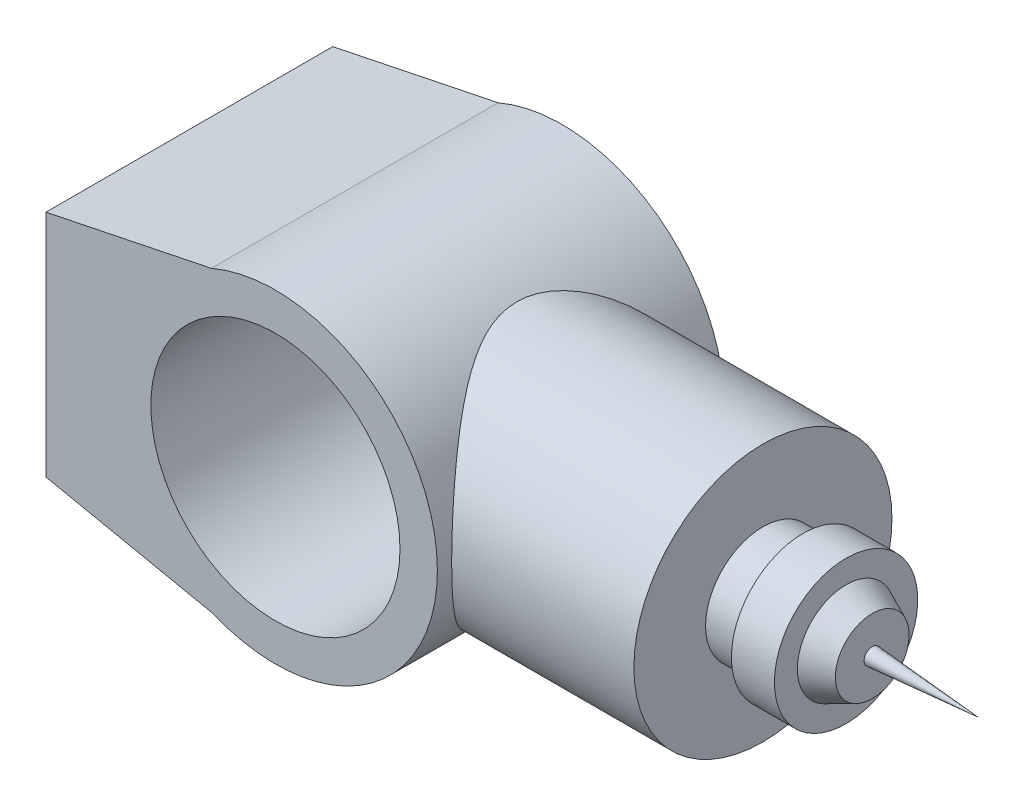
ISO-10303-21;
HEADER;
FILE_DESCRIPTION(('STEP AP214'),'2;1');
FILE_NAME('part.step','',(''),(''),'','','');
FILE_SCHEMA(('AUTOMOTIVE_DESIGN { 1 0 10303 214 1 1 1 1 }'));
ENDSEC;
DATA;
#1=APPLICATION_CONTEXT('core data for automotive mechanical design processes');
#2=APPLICATION_PROTOCOL_DEFINITION('international standard','automotive_design',2000,#1);
#3=PRODUCT_CONTEXT('',#1,'mechanical');
#4=PRODUCT('Part','Part','',(#3));
#5=PRODUCT_RELATED_PRODUCT_CATEGORY('part','',(#4));
#6=PRODUCT_DEFINITION_FORMATION('','',#4);
#7=PRODUCT_DEFINITION_CONTEXT('part definition',#1,'design');
#8=PRODUCT_DEFINITION('design','',#6,#7);
#9=PRODUCT_DEFINITION_SHAPE('','',#8);
#10=(LENGTH_UNIT() NAMED_UNIT(*) SI_UNIT(.MILLI.,.METRE.));
#11=(NAMED_UNIT(*) PLANE_ANGLE_UNIT() SI_UNIT($,.RADIAN.));
#12=(NAMED_UNIT(*) SI_UNIT($,.STERADIAN.) SOLID_ANGLE_UNIT());
#13=UNCERTAINTY_MEASURE_WITH_UNIT(LENGTH_MEASURE(1.E-05),#10,'distance_accuracy_value','');
#14=(GEOMETRIC_REPRESENTATION_CONTEXT(3) GLOBAL_UNCERTAINTY_ASSIGNED_CONTEXT((#13)) GLOBAL_UNIT_ASSIGNED_CONTEXT((#10,
#11,#12)) REPRESENTATION_CONTEXT('',''));
#15=CARTESIAN_POINT('',(0.,0.,0.));
#16=DIRECTION('',(0.,0.,1.));
#17=DIRECTION('',(1.,0.,0.));
#18=AXIS2_PLACEMENT_3D('',#15,#16,#17);
#19=CARTESIAN_POINT('',(0.,0.,50.));
#20=DIRECTION('',(0.,0.,1.));
#21=DIRECTION('',(1.,0.,0.));
#22=AXIS2_PLACEMENT_3D('',#19,#20,#21);
#23=PLANE('',#22);
#24=CARTESIAN_POINT('',(0.,0.,50.));
#25=DIRECTION('',(0.,0.,1.));
#26=DIRECTION('',(1.,0.,0.));
#27=AXIS2_PLACEMENT_3D('',#24,#25,#26);
#28=CIRCLE('',#27,56.4801597905867);
#29=CARTESIAN_POINT('',(-21.8291708753902,-52.0912252578419,50.));
#30=VERTEX_POINT('',#29);
#31=CARTESIAN_POINT('',(-22.3463617770713,51.8714619545127,50.));
#32=VERTEX_POINT('',#31);
#33=EDGE_CURVE('E194',#30,#32,#28,.T.);
#34=ORIENTED_EDGE('',*,*,#33,.T.);
#35=DIRECTION('',(-0.9794516901474,-0.201678919739774,0.));
#36=VECTOR('',#35,1.);
#37=CARTESIAN_POINT('',(-80.,40.,50.));
#38=LINE('',#37,#36);
#39=CARTESIAN_POINT('',(-80.,40.,50.));
#40=VERTEX_POINT('',#39);
#41=EDGE_CURVE('E81',#32,#40,#38,.T.);
#42=ORIENTED_EDGE('',*,*,#41,.T.);
#43=DIRECTION('',(0.,-1.,0.));
#44=VECTOR('',#43,1.);
#45=CARTESIAN_POINT('',(-80.,-40.,50.));
#46=LINE('',#45,#44);
#47=CARTESIAN_POINT('',(-80.,-40.,50.));
#48=VERTEX_POINT('',#47);
#49=EDGE_CURVE('E190',#40,#48,#46,.T.);
#50=ORIENTED_EDGE('',*,*,#49,.T.);
#51=DIRECTION('',(0.979073397914533,-0.203507448257034,0.));
#52=VECTOR('',#51,1.);
#53=CARTESIAN_POINT('',(-80.,-40.,50.));
#54=LINE('',#53,#52);
#55=EDGE_CURVE('E50',#48,#30,#54,.T.);
#56=ORIENTED_EDGE('',*,*,#55,.T.);
#57=EDGE_LOOP('',(#34,#42,#50,#56));
#58=FACE_BOUND('',#57,.T.);
#59=CARTESIAN_POINT('',(0.,0.,50.));
#60=DIRECTION('',(0.,0.,1.));
#61=DIRECTION('',(1.,0.,0.));
#62=AXIS2_PLACEMENT_3D('',#59,#60,#61);
#63=CIRCLE('',#62,43.4446904801854);
#64=CARTESIAN_POINT('',(43.4446904801854,0.,50.));
#65=VERTEX_POINT('',#64);
#66=EDGE_CURVE('E126',#65,#65,#63,.T.);
#67=ORIENTED_EDGE('',*,*,#66,.F.);
#68=EDGE_LOOP('',(#67));
#69=FACE_BOUND('',#68,.T.);
#70=ADVANCED_FACE('F33',(#58,#69),#23,.T.);
#71=CARTESIAN_POINT('',(0.,0.,-50.));
#72=DIRECTION('',(0.,0.,1.));
#73=DIRECTION('',(1.,0.,0.));
#74=AXIS2_PLACEMENT_3D('',#71,#72,#73);
#75=PLANE('',#74);
#76=CARTESIAN_POINT('',(0.,0.,-50.));
#77=DIRECTION('',(0.,0.,1.));
#78=DIRECTION('',(1.,0.,0.));
#79=AXIS2_PLACEMENT_3D('',#76,#77,#78);
#80=CIRCLE('',#79,56.4801597905867);
#81=CARTESIAN_POINT('',(-21.8291708753902,-52.0912252578419,-50.));
#82=VERTEX_POINT('',#81);
#83=CARTESIAN_POINT('',(-22.3463617770713,51.8714619545127,-50.));
#84=VERTEX_POINT('',#83);
#85=EDGE_CURVE('E188',#82,#84,#80,.T.);
#86=ORIENTED_EDGE('',*,*,#85,.F.);
#87=DIRECTION('',(0.979073397914533,-0.203507448257034,0.));
#88=VECTOR('',#87,1.);
#89=CARTESIAN_POINT('',(-80.,-40.,-50.));
#90=LINE('',#89,#88);
#91=CARTESIAN_POINT('',(-80.,-40.,-50.));
#92=VERTEX_POINT('',#91);
#93=EDGE_CURVE('E74',#92,#82,#90,.T.);
#94=ORIENTED_EDGE('',*,*,#93,.F.);
#95=DIRECTION('',(0.,-1.,0.));
#96=VECTOR('',#95,1.);
#97=CARTESIAN_POINT('',(-80.,-40.,-50.));
#98=LINE('',#97,#96);
#99=CARTESIAN_POINT('',(-80.,40.,-50.));
#100=VERTEX_POINT('',#99);
#101=EDGE_CURVE('E68',#100,#92,#98,.T.);
#102=ORIENTED_EDGE('',*,*,#101,.F.);
#103=DIRECTION('',(-0.9794516901474,-0.201678919739774,0.));
#104=VECTOR('',#103,1.);
#105=CARTESIAN_POINT('',(-80.,40.,-50.));
#106=LINE('',#105,#104);
#107=EDGE_CURVE('E183',#84,#100,#106,.T.);
#108=ORIENTED_EDGE('',*,*,#107,.F.);
#109=EDGE_LOOP('',(#86,#94,#102,#108));
#110=FACE_BOUND('',#109,.T.);
#111=CARTESIAN_POINT('',(0.,0.,-50.));
#112=DIRECTION('',(0.,0.,1.));
#113=DIRECTION('',(1.,0.,0.));
#114=AXIS2_PLACEMENT_3D('',#111,#112,#113);
#115=CIRCLE('',#114,43.4446904801854);
#116=CARTESIAN_POINT('',(43.4446904801854,0.,-50.));
#117=VERTEX_POINT('',#116);
#118=EDGE_CURVE('E118',#117,#117,#115,.T.);
#119=ORIENTED_EDGE('',*,*,#118,.T.);
#120=EDGE_LOOP('',(#119));
#121=FACE_BOUND('',#120,.T.);
#122=ADVANCED_FACE('F163',(#110,#121),#75,.F.);
#123=CARTESIAN_POINT('',(0.,0.,50.));
#124=DIRECTION('',(0.,0.,-1.));
#125=DIRECTION('',(-1.,0.,0.));
#126=AXIS2_PLACEMENT_3D('',#123,#124,#125);
#127=CYLINDRICAL_SURFACE('',#126,56.4801597905867);
#128=CARTESIAN_POINT('',(56.4801597905867,0.,-45.));
#129=CARTESIAN_POINT('',(56.4801490798055,1.08194847817532,-44.9999890041088));
#130=CARTESIAN_POINT('',(56.448994289608,2.16421423732892,-44.9609029510426));
#131=CARTESIAN_POINT('',(56.325074818525,4.31985373581088,-44.8052201871849));
#132=CARTESIAN_POINT('',(56.2322844100586,5.39322357234433,-44.6885911088163));
#133=CARTESIAN_POINT('',(55.9870741083963,7.52379527608833,-44.3796446794653));
#134=CARTESIAN_POINT('',(55.8345626891381,8.58096972634964,-44.1872111508567));
#135=CARTESIAN_POINT('',(55.4733515817805,10.6695372930669,-43.7298974200294));
#136=CARTESIAN_POINT('',(55.2646565446941,11.7009325358665,-43.4650232145925));
#137=CARTESIAN_POINT('',(54.7969131215361,13.7251313087716,-42.8687205885737));
#138=CARTESIAN_POINT('',(54.5381874206126,14.7181356630654,-42.5377182470617));
#139=CARTESIAN_POINT('',(53.9744769207323,16.6671391871946,-41.8125308490515));
#140=CARTESIAN_POINT('',(53.6694921608157,17.6231383882596,-41.4183458458762));
#141=CARTESIAN_POINT('',(53.0185941144325,19.4940550279297,-40.5713727347179));
#142=CARTESIAN_POINT('',(52.6726865261201,20.4089781616099,-40.1185927847585));
#143=CARTESIAN_POINT('',(51.9452403195423,22.1952843297573,-39.1586222118875));
#144=CARTESIAN_POINT('',(51.563694442066,23.0666584379355,-38.6514205005913));
#145=CARTESIAN_POINT('',(50.900146238911,24.4863500416698,-37.7607406030708));
#146=CARTESIAN_POINT('',(50.6263465240033,25.0472058640008,-37.3909770386932));
#147=CARTESIAN_POINT('',(50.0668370106071,26.1476824504989,-36.6298538840062));
#148=CARTESIAN_POINT('',(49.7811297599063,26.6873077097004,-36.2384989077454));
#149=CARTESIAN_POINT('',(48.9083008065198,28.2744431531699,-35.033146981738));
#150=CARTESIAN_POINT('',(48.3055648993475,29.2900162141145,-34.1879870551142));
#151=CARTESIAN_POINT('',(47.0704752656957,31.236381130108,-32.4194843079937));
#152=CARTESIAN_POINT('',(46.4380478374194,32.1669430677628,-31.4959417792972));
#153=CARTESIAN_POINT('',(45.1585765208608,33.9397298659973,-29.5770292773992));
#154=CARTESIAN_POINT('',(44.5115342802137,34.7819646245323,-28.5816673734329));
#155=CARTESIAN_POINT('',(43.5363146920766,35.9843027477771,-27.0290046715754));
#156=CARTESIAN_POINT('',(43.2079490357804,36.3776663268331,-26.4972342124482));
#157=CARTESIAN_POINT('',(42.5533949123367,37.141213453024,-25.4159078222747));
#158=CARTESIAN_POINT('',(42.2272065149992,37.5113962600668,-24.8663513242227));
#159=CARTESIAN_POINT('',(41.5792268527739,38.2283920028481,-23.749330034365));
#160=CARTESIAN_POINT('',(41.2574372604183,38.5751962362747,-23.1818586881856));
#161=CARTESIAN_POINT('',(40.6209557593205,39.2448690194126,-22.0291736336702));
#162=CARTESIAN_POINT('',(40.3062630651642,39.5677402269277,-21.4439619056346));
#163=CARTESIAN_POINT('',(39.687613993395,40.1882215218436,-20.2571959778527));
#164=CARTESIAN_POINT('',(39.3836308430431,40.4858976656273,-19.6556903391146));
#165=CARTESIAN_POINT('',(38.7886479733555,41.0562915650993,-18.4346151921195));
#166=CARTESIAN_POINT('',(38.4976488962723,41.3290080868689,-17.8150447927965));
#167=CARTESIAN_POINT('',(37.932396654518,41.8484043342082,-16.5581724439605));
#168=CARTESIAN_POINT('',(37.6581317724254,42.0951023684067,-15.9208833671369));
#169=CARTESIAN_POINT('',(37.1301443806895,42.5615426745179,-14.6282974744494));
#170=CARTESIAN_POINT('',(36.8764182002849,42.7812897668464,-13.9730039045885));
#171=CARTESIAN_POINT('',(36.3562737894176,43.2245766304839,-12.5411926538949));
#172=CARTESIAN_POINT('',(36.0940205324896,43.443389285252,-11.7616740578291));
#173=CARTESIAN_POINT('',(35.610079597513,43.8409496559815,-10.1801621382321));
#174=CARTESIAN_POINT('',(35.3883854039571,44.0197038080785,-9.37817244842427));
#175=CARTESIAN_POINT('',(34.9934742278762,44.3342866746166,-7.7557812622282));
#176=CARTESIAN_POINT('',(34.8201559056468,44.4702052011985,-6.93542220353495));
#177=CARTESIAN_POINT('',(34.5283828255017,44.6971317326353,-5.27875088091801));
#178=CARTESIAN_POINT('',(34.4099274298984,44.7881402594928,-4.44243880253852));
#179=CARTESIAN_POINT('',(34.232612482432,44.9238183553016,-2.75231838819131));
#180=CARTESIAN_POINT('',(34.1742772862381,44.968080291726,-1.89842128512124));
#181=CARTESIAN_POINT('',(34.1220257926352,45.0077430478503,-0.187535179070918));
#182=CARTESIAN_POINT('',(34.1281065089961,45.0031461325769,0.66945367873878));
#183=CARTESIAN_POINT('',(34.2043903516301,44.9451927768353,2.37953433911898));
#184=CARTESIAN_POINT('',(34.2746427254502,44.8917988878678,3.23262264286191));
#185=CARTESIAN_POINT('',(34.4757561322344,44.7375292180892,4.92725133793581));
#186=CARTESIAN_POINT('',(34.6066256680957,44.6366467759262,5.76879009213018));
#187=CARTESIAN_POINT('',(34.9486074596776,44.3695574319704,7.56965789165123));
#188=CARTESIAN_POINT('',(35.1692840111516,44.1954159446459,8.52598560480035));
#189=CARTESIAN_POINT('',(35.672731001238,43.7900527918119,10.40962348427));
#190=CARTESIAN_POINT('',(35.9555150852902,43.5588185812611,11.3369272225972));
#191=CARTESIAN_POINT('',(36.5718085700365,43.0426890475729,13.1616213605331));
#192=CARTESIAN_POINT('',(36.9054401055607,42.7576641162141,14.0589332168519));
#193=CARTESIAN_POINT('',(37.6116851421995,42.1377529845852,15.8202929330452));
#194=CARTESIAN_POINT('',(37.9843017046987,41.8028628676669,16.6843381732865));
#195=CARTESIAN_POINT('',(38.6581581974045,41.1789768570652,18.1591871902792));
#196=CARTESIAN_POINT('',(38.9528450655696,40.900605388801,18.7775489674235));
#197=CARTESIAN_POINT('',(39.5547284235623,40.3188178098974,19.9962217452197));
#198=CARTESIAN_POINT('',(39.8619261323029,40.0153992559849,20.5965309770855));
#199=CARTESIAN_POINT('',(40.4857882856631,39.3840880704753,21.779422255467));
#200=CARTESIAN_POINT('',(40.8024562442464,39.0561862850303,22.3619975558221));
#201=CARTESIAN_POINT('',(41.442343498522,38.3765375153518,23.5092710647277));
#202=CARTESIAN_POINT('',(41.7655626120635,38.0247911934653,24.0739697692107));
#203=CARTESIAN_POINT('',(42.7419953503688,36.9334918667565,25.7426886634857));
#204=CARTESIAN_POINT('',(43.4013839774214,36.1584775636448,26.820212206811));
#205=CARTESIAN_POINT('',(44.7185006672836,34.5162684922247,28.9030349177571));
#206=CARTESIAN_POINT('',(45.3762289802201,33.6490885766341,29.9083456790195));
#207=CARTESIAN_POINT('',(46.6910936541883,31.8004545398335,31.8683360714052));
#208=CARTESIAN_POINT('',(47.347805024329,30.8166874337358,32.8211242822883));
#209=CARTESIAN_POINT('',(48.6282988572657,28.7536179502832,34.6427824842193));
#210=CARTESIAN_POINT('',(49.2520764966965,27.6743016407271,35.5116401984586));
#211=CARTESIAN_POINT('',(50.1506986026861,25.9869453853176,36.7445593791975));
#212=CARTESIAN_POINT('',(50.4437901057639,25.4137047289331,37.1434400455007));
#213=CARTESIAN_POINT('',(51.0160859924044,24.2443997661933,37.91701997149));
#214=CARTESIAN_POINT('',(51.2952912538392,23.6483369068582,38.2917207602463));
#215=CARTESIAN_POINT('',(51.8377785890197,22.4342379429226,39.0154347649));
#216=CARTESIAN_POINT('',(52.1010686043264,21.816213045771,39.3644608114379));
#217=CARTESIAN_POINT('',(52.6100427243822,20.5585077703442,40.0356842501829));
#218=CARTESIAN_POINT('',(52.8557225895533,19.9188222315637,40.3578751849408));
#219=CARTESIAN_POINT('',(53.4268059899233,18.3452908586664,41.1034597469932));
#220=CARTESIAN_POINT('',(53.7422689201226,17.4009046234005,41.5124081434675));
#221=CARTESIAN_POINT('',(54.3283370323337,15.4742825126755,42.2683896030518));
#222=CARTESIAN_POINT('',(54.5989533478711,14.4920561061896,42.6154380349528));
#223=CARTESIAN_POINT('',(54.9674563105849,12.9942967914643,43.0862189756496));
#224=CARTESIAN_POINT('',(55.0840440945677,12.4910243884899,43.2348351798317));
#225=CARTESIAN_POINT('',(55.304206325877,11.4770370471836,43.5149892062012));
#226=CARTESIAN_POINT('',(55.4077829877875,10.9663233919643,43.6465299348817));
#227=CARTESIAN_POINT('',(55.6982153683615,9.42395814421891,44.0148352761923));
#228=CARTESIAN_POINT('',(55.8648011098157,8.38197064895775,44.2253182514331));
#229=CARTESIAN_POINT('',(56.1408515462913,6.27298090561425,44.5735129747226));
#230=CARTESIAN_POINT('',(56.2500215583487,5.2058784212583,44.7108493468411));
#231=CARTESIAN_POINT('',(56.4074608222287,3.06004339985907,44.9087608757485));
#232=CARTESIAN_POINT('',(56.4557301880073,1.98131088458149,44.9693361761712));
#233=CARTESIAN_POINT('',(56.4902035140335,-0.178574050382491,45.0126072343173));
#234=CARTESIAN_POINT('',(56.4764146722895,-1.25972617488454,44.9953120240866));
#235=CARTESIAN_POINT('',(56.3871183770094,-3.4153896016209,44.8831797995315));
#236=CARTESIAN_POINT('',(56.3116138436661,-4.48990121563958,44.7883464540682));
#237=CARTESIAN_POINT('',(56.1089190892333,-6.54026120617289,44.5332213585174));
#238=CARTESIAN_POINT('',(55.9862164421218,-7.51727154714136,44.3786081833681));
#239=CARTESIAN_POINT('',(55.6922596982178,-9.45187005931009,44.0071838487617));
#240=CARTESIAN_POINT('',(55.5210086244936,-10.4094594358597,43.7903765620677));
#241=CARTESIAN_POINT('',(55.1330287698177,-12.2999617012813,43.297407838295));
#242=CARTESIAN_POINT('',(54.9162907331331,-13.2328695243545,43.0212343210383));
#243=CARTESIAN_POINT('',(54.4410231388817,-15.0692806165621,42.4128823854619));
#244=CARTESIAN_POINT('',(54.1824912442662,-15.9727822379506,42.080700835214));
#245=CARTESIAN_POINT('',(53.6095057186254,-17.8047678343951,41.3404058097686));
#246=CARTESIAN_POINT('',(53.2924997377199,-18.7310176453997,40.9287459303663));
#247=CARTESIAN_POINT('',(52.6207431598021,-20.5426220996393,40.0501477468741));
#248=CARTESIAN_POINT('',(52.2659913595033,-21.4279754378581,39.583207680472));
#249=CARTESIAN_POINT('',(51.5240404728323,-23.1552399252388,38.5982281459078));
#250=CARTESIAN_POINT('',(51.1368473800373,-23.9971590526995,38.0801981135751));
#251=CARTESIAN_POINT('',(50.3350778566246,-25.6363194537336,36.9965480291522));
#252=CARTESIAN_POINT('',(49.9204973426782,-26.4335540321603,36.4309208771095));
#253=CARTESIAN_POINT('',(49.2415310912367,-27.6686973063807,35.493352438247));
#254=CARTESIAN_POINT('',(48.9842584665115,-28.1214584950681,35.1356604871426));
#255=CARTESIAN_POINT('',(48.4630258598532,-29.010499088238,34.4052585657858));
#256=CARTESIAN_POINT('',(48.199067445806,-29.4467822982726,34.0325521047029));
#257=CARTESIAN_POINT('',(47.3985974723289,-30.7310738192621,32.8924323537049));
#258=CARTESIAN_POINT('',(46.8535223994463,-31.5544676844404,32.1030615695633));
#259=CARTESIAN_POINT('',(45.7480853172337,-33.1369232244461,30.4670907033706));
#260=CARTESIAN_POINT('',(45.1876835719795,-33.895791480195,29.6203313475462));
#261=CARTESIAN_POINT('',(44.0624067397232,-35.34621296268,27.8735363322164));
#262=CARTESIAN_POINT('',(43.4975313857801,-36.0377621392458,26.9734974724467));
#263=CARTESIAN_POINT('',(42.5959332687721,-37.0927061672908,25.487308065998));
#264=CARTESIAN_POINT('',(42.2572373591003,-37.4778105627733,24.9176228683115));
#265=CARTESIAN_POINT('',(41.584704800398,-38.2226685298556,23.7592449967239));
#266=CARTESIAN_POINT('',(41.2508673425955,-38.5824263600246,23.1705555401504));
#267=CARTESIAN_POINT('',(40.5906368282981,-39.276433091123,21.9736357268506));
#268=CARTESIAN_POINT('',(40.2642486823378,-39.6106654880434,21.3653930826951));
#269=CARTESIAN_POINT('',(39.6223155767451,-40.2527845423984,20.1295385263664));
#270=CARTESIAN_POINT('',(39.3067709538458,-40.5606703821129,19.501926013831));
#271=CARTESIAN_POINT('',(38.691301094682,-41.1481697758182,18.2295654597852));
#272=CARTESIAN_POINT('',(38.3913200849147,-41.4278882352508,17.5848932198664));
#273=CARTESIAN_POINT('',(37.8097437856823,-41.9593509858314,16.2761217551219));
#274=CARTESIAN_POINT('',(37.5281495273458,-42.2110937086555,15.6120214437895));
#275=CARTESIAN_POINT('',(36.7181769608216,-42.9220019635938,13.5917740209843));
#276=CARTESIAN_POINT('',(36.2235683764679,-43.3378213012396,12.2055895171668));
#277=CARTESIAN_POINT('',(35.5653039511701,-43.8771778375983,10.0205817791401));
#278=CARTESIAN_POINT('',(35.3544445143264,-44.0469037842235,9.24695855922565));
#279=CARTESIAN_POINT('',(34.9776021634283,-44.3467442346427,7.68121293446519));
#280=CARTESIAN_POINT('',(34.8116112010006,-44.4768658430732,6.88909387507858));
#281=CARTESIAN_POINT('',(34.5310641069706,-44.6950309642541,5.29174447533578));
#282=CARTESIAN_POINT('',(34.4164003694337,-44.7831625330442,4.48654526718253));
#283=CARTESIAN_POINT('',(34.2429116673695,-44.9159604890388,2.86650369731368));
#284=CARTESIAN_POINT('',(34.1840865985603,-44.9606269574169,2.05166135361005));
#285=CARTESIAN_POINT('',(34.1249035456434,-45.0055648371611,0.414985454152047));
#286=CARTESIAN_POINT('',(34.1248054051921,-45.0056389448043,-0.406863082686534));
#287=CARTESIAN_POINT('',(34.1837302945042,-44.9608978922079,-2.04716412842433));
#288=CARTESIAN_POINT('',(34.2427526887857,-44.9160832144742,-2.86561667373183));
#289=CARTESIAN_POINT('',(34.4172596758248,-44.7825037398712,-4.49396891537921));
#290=CARTESIAN_POINT('',(34.5328251001273,-44.6936760214885,-5.30385466659082));
#291=CARTESIAN_POINT('',(34.8154359855785,-44.4738768457275,-6.90874193678816));
#292=CARTESIAN_POINT('',(34.9824893751335,-44.3428988976828,-7.70374114344723));
#293=CARTESIAN_POINT('',(35.4195591742514,-43.9950362374127,-9.51451977335248));
#294=CARTESIAN_POINT('',(35.7054387266162,-43.7641365380933,-10.5237847688924));
#295=CARTESIAN_POINT('',(36.338978850632,-43.2395168078735,-12.5058549422312));
#296=CARTESIAN_POINT('',(36.686661447123,-42.945774373996,-13.4786469719538));
#297=CARTESIAN_POINT('',(37.4303534197263,-42.2991780188976,-15.3882562006877));
#298=CARTESIAN_POINT('',(37.8264858825175,-41.9461726566929,-16.3249734765808));
#299=CARTESIAN_POINT('',(38.6537302250553,-41.1851111308295,-18.1596557930729));
#300=CARTESIAN_POINT('',(39.0848428579613,-40.7770537817192,-19.0576199986402));
#301=CARTESIAN_POINT('',(39.8449637391416,-40.0322926095997,-20.5646929887188));
#302=CARTESIAN_POINT('',(40.1680585099505,-39.7083931155323,-21.1831944747864));
#303=CARTESIAN_POINT('',(40.8233391955507,-39.0343989202395,-22.4008932456039));
#304=CARTESIAN_POINT('',(41.1555258511826,-38.6843020803023,-23.0000889485337));
#305=CARTESIAN_POINT('',(41.8260575746922,-37.9583140809627,-24.1794552207198));
#306=CARTESIAN_POINT('',(42.1644048360015,-37.5824135970174,-24.7596187993069));
#307=CARTESIAN_POINT('',(42.8444035574618,-36.8053293140144,-25.9006585845218));
#308=CARTESIAN_POINT('',(43.186054931153,-36.4041461750295,-26.4615352940957));
#309=CARTESIAN_POINT('',(44.2120570868039,-35.1632381271295,-28.1148748800498));
#310=CARTESIAN_POINT('',(44.8977660847803,-34.2858232888317,-29.1785846943908));
#311=CARTESIAN_POINT('',(46.2544086466977,-32.4323514572452,-31.2257624914913));
#312=CARTESIAN_POINT('',(46.9253465149395,-31.4563236757797,-32.2092540819498));
#313=CARTESIAN_POINT('',(48.1368542743808,-29.5620821215041,-33.9481262592167));
#314=CARTESIAN_POINT('',(48.681746681602,-28.6576050036894,-34.7154647630932));
#315=CARTESIAN_POINT('',(49.7398424674497,-26.7790668775621,-36.1842913065323));
#316=CARTESIAN_POINT('',(50.2530459812085,-25.8050061660156,-36.885779626909));
#317=CARTESIAN_POINT('',(51.2375706033328,-23.7902410527181,-38.2162273727842));
#318=CARTESIAN_POINT('',(51.7089383728697,-22.7496131841322,-38.8452678416725));
#319=CARTESIAN_POINT('',(52.60071457024,-20.6039345731056,-40.0246877640223));
#320=CARTESIAN_POINT('',(53.0211344594607,-19.4988984032986,-40.5750849143277));
#321=CARTESIAN_POINT('',(53.7313476405119,-17.4333049540441,-41.4984314985312));
#322=CARTESIAN_POINT('',(54.0310403439842,-16.4824434155346,-41.8854968496777));
#323=CARTESIAN_POINT('',(54.5846103274428,-14.5445485286992,-42.5971982475778));
#324=CARTESIAN_POINT('',(54.8384878701306,-13.5575153878183,-42.9218346522961));
#325=CARTESIAN_POINT('',(55.2952118792751,-11.5542743465558,-43.5038445217626));
#326=CARTESIAN_POINT('',(55.4981518677845,-10.5381237867595,-43.7613412900651));
#327=CARTESIAN_POINT('',(55.8494186651135,-8.48166423596492,-44.2059689092007));
#328=CARTESIAN_POINT('',(55.9977667464198,-7.44136482324217,-44.393127169006));
#329=CARTESIAN_POINT('',(56.2372674977082,-5.33873313692205,-44.694858063163));
#330=CARTESIAN_POINT('',(56.3281603799393,-4.27632291056561,-44.8091010280707));
#331=CARTESIAN_POINT('',(56.4192506890648,-2.67631153469323,-44.9235331516932));
#332=CARTESIAN_POINT('',(56.4420726539619,-2.14181718268684,-44.9521885010935));
#333=CARTESIAN_POINT('',(56.4725318601989,-1.07157468871673,-44.99042716416));
#334=CARTESIAN_POINT('',(56.4801650950147,-0.535826253249707,-45.0000054456264));
#335=CARTESIAN_POINT('',(56.4801597905867,0.,-45.));
#336=B_SPLINE_CURVE_WITH_KNOTS('',3,(#128,#129,#130,#131,#132,#133,#134,#135,#136,#137,#138,
#139,#140,#141,#142,#143,#144,#145,#146,#147,#148,#149,#150,#151,#152,#153,#154,#155,#156,#157,
#158,#159,#160,#161,#162,#163,#164,#165,#166,#167,#168,#169,#170,#171,#172,#173,#174,#175,#176,
#177,#178,#179,#180,#181,#182,#183,#184,#185,#186,#187,#188,#189,#190,#191,#192,#193,#194,#195,
#196,#197,#198,#199,#200,#201,#202,#203,#204,#205,#206,#207,#208,#209,#210,#211,#212,#213,#214,
#215,#216,#217,#218,#219,#220,#221,#222,#223,#224,#225,#226,#227,#228,#229,#230,#231,#232,#233,
#234,#235,#236,#237,#238,#239,#240,#241,#242,#243,#244,#245,#246,#247,#248,#249,#250,#251,#252,
#253,#254,#255,#256,#257,#258,#259,#260,#261,#262,#263,#264,#265,#266,#267,#268,#269,#270,#271,
#272,#273,#274,#275,#276,#277,#278,#279,#280,#281,#282,#283,#284,#285,#286,#287,#288,#289,#290,
#291,#292,#293,#294,#295,#296,#297,#298,#299,#300,#301,#302,#303,#304,#305,#306,#307,#308,#309,
#310,#311,#312,#313,#314,#315,#316,#317,#318,#319,#320,#321,#322,#323,#324,#325,#326,#327,#328,
#329,#330,#331,#332,#333,#334,#335),.UNSPECIFIED.,.T.,.F.,(4,2,2,2,2,2,2,2,2,2,2,2,2,2,2,2,2,2,
2,2,2,2,2,2,2,2,2,2,2,2,2,2,2,2,2,2,2,2,2,2,2,2,2,2,2,2,2,2,2,2,2,2,2,2,2,2,2,2,2,2,2,2,2,2,2,2,
2,2,2,2,2,2,2,2,2,2,2,2,2,2,2,2,2,2,2,2,2,2,2,2,2,2,2,2,2,2,2,2,2,2,2,2,2,4),(0.,
3.24525282867324,6.49186112384375,9.74346463953291,12.9947990625096,16.2258234152963,
19.4568450412795,22.687417303438,25.9186490461842,28.0942374870483,30.2693627956902,
34.6203623240116,38.9828010321431,43.3447503612784,45.5596934494612,47.7747072180729,
49.9905409897113,52.2061283193826,54.4157142395105,56.6254093351076,58.8335389948477,
61.0412731331923,63.5924240951917,66.1431648735011,68.6885214537054,71.2338484477547,
73.8011920451343,76.3684166246391,78.9376130377451,81.5071699466463,84.4929621587703,
87.4794110267823,90.4731497738569,93.4671237875318,95.6845738259827,97.9022404266609,
100.120740366091,102.339178705884,106.780256350191,111.220619385854,115.771873643593,
120.323792624399,122.595205606607,124.866474809734,127.136601152202,129.40727219619,
132.633176007818,135.858277759771,137.470511818423,139.082471090664,142.306030049284,
145.545976146367,148.785916180918,152.025480430944,155.264891403831,158.251795713622,
161.238514072327,164.225840761746,167.213334555725,170.39632544998,173.579417844168,
176.761923448572,179.944904624388,181.83980070585,183.734256455516,187.523399520379,
191.323527315987,195.123883600532,197.42288224989,199.721493710383,202.021579020518,
204.321735692708,206.612981618424,208.904355926986,213.479547259711,215.936469058293,
218.392949848661,220.844256303253,223.295558179882,225.757706027374,228.219827409721,
230.685478867193,233.151510189385,236.368723969336,239.587086579416,242.81380222329,
246.040587360135,248.347826279317,250.65525376394,252.96351950759,255.271725012605,
259.88603205699,264.498976204162,268.411250495962,272.323508103351,276.231345881562,
280.138302902475,283.343571585388,286.54882188889,289.748143537846,292.946217203787,
296.158649654499,297.765411151263,299.372596427746),.UNSPECIFIED.);
#337=CARTESIAN_POINT('',(56.4801597905867,0.,-45.));
#338=VERTEX_POINT('',#337);
#339=EDGE_CURVE('E114',#338,#338,#336,.T.);
#340=ORIENTED_EDGE('',*,*,#339,.F.);
#341=EDGE_LOOP('',(#340));
#342=FACE_BOUND('',#341,.T.);
#343=ORIENTED_EDGE('',*,*,#85,.T.);
#344=DIRECTION('',(0.,0.,-1.));
#345=VECTOR('',#344,1.);
#346=CARTESIAN_POINT('',(-22.3463617770713,51.8714619545127,50.));
#347=LINE('',#346,#345);
#348=EDGE_CURVE('E11',#32,#84,#347,.T.);
#349=ORIENTED_EDGE('',*,*,#348,.F.);
#350=ORIENTED_EDGE('',*,*,#33,.F.);
#351=DIRECTION('',(0.,0.,-1.));
#352=VECTOR('',#351,1.);
#353=CARTESIAN_POINT('',(-21.8291708753902,-52.0912252578419,50.));
#354=LINE('',#353,#352);
#355=EDGE_CURVE('E198',#30,#82,#354,.T.);
#356=ORIENTED_EDGE('',*,*,#355,.T.);
#357=EDGE_LOOP('',(#343,#349,#350,#356));
#358=FACE_BOUND('',#357,.T.);
#359=ADVANCED_FACE('F35',(#342,#358),#127,.T.);
#360=CARTESIAN_POINT('',(-80.,40.,50.));
#361=DIRECTION('',(0.201678919739774,-0.9794516901474,0.));
#362=DIRECTION('',(0.9794516901474,0.201678919739774,0.));
#363=AXIS2_PLACEMENT_3D('',#360,#361,#362);
#364=PLANE('',#363);
#365=ORIENTED_EDGE('',*,*,#107,.T.);
#366=DIRECTION('',(0.,0.,-1.));
#367=VECTOR('',#366,1.);
#368=CARTESIAN_POINT('',(-80.,40.,50.));
#369=LINE('',#368,#367);
#370=EDGE_CURVE('E42',#40,#100,#369,.T.);
#371=ORIENTED_EDGE('',*,*,#370,.F.);
#372=ORIENTED_EDGE('',*,*,#41,.F.);
#373=ORIENTED_EDGE('',*,*,#348,.T.);
#374=EDGE_LOOP('',(#365,#371,#372,#373));
#375=FACE_BOUND('',#374,.T.);
#376=ADVANCED_FACE('F177',(#375),#364,.F.);
#377=CARTESIAN_POINT('',(-80.,-40.,50.));
#378=DIRECTION('',(1.,0.,0.));
#379=DIRECTION('',(0.,1.,0.));
#380=AXIS2_PLACEMENT_3D('',#377,#378,#379);
#381=PLANE('',#380);
#382=ORIENTED_EDGE('',*,*,#101,.T.);
#383=DIRECTION('',(0.,0.,-1.));
#384=VECTOR('',#383,1.);
#385=CARTESIAN_POINT('',(-80.,-40.,50.));
#386=LINE('',#385,#384);
#387=EDGE_CURVE('E191',#48,#92,#386,.T.);
#388=ORIENTED_EDGE('',*,*,#387,.F.);
#389=ORIENTED_EDGE('',*,*,#49,.F.);
#390=ORIENTED_EDGE('',*,*,#370,.T.);
#391=EDGE_LOOP('',(#382,#388,#389,#390));
#392=FACE_BOUND('',#391,.T.);
#393=ADVANCED_FACE('F175',(#392),#381,.F.);
#394=CARTESIAN_POINT('',(-80.,-40.,50.));
#395=DIRECTION('',(0.203507448257034,0.979073397914533,0.));
#396=DIRECTION('',(-0.979073397914534,0.203507448257034,0.));
#397=AXIS2_PLACEMENT_3D('',#394,#395,#396);
#398=PLANE('',#397);
#399=ORIENTED_EDGE('',*,*,#93,.T.);
#400=ORIENTED_EDGE('',*,*,#355,.F.);
#401=ORIENTED_EDGE('',*,*,#55,.F.);
#402=ORIENTED_EDGE('',*,*,#387,.T.);
#403=EDGE_LOOP('',(#399,#400,#401,#402));
#404=FACE_BOUND('',#403,.T.);
#405=ADVANCED_FACE('F172',(#404),#398,.F.);
#406=CARTESIAN_POINT('',(0.,0.,50.));
#407=DIRECTION('',(0.,0.,-1.));
#408=DIRECTION('',(-1.,0.,0.));
#409=AXIS2_PLACEMENT_3D('',#406,#407,#408);
#410=CYLINDRICAL_SURFACE('',#409,43.4446904801854);
#411=ORIENTED_EDGE('',*,*,#66,.T.);
#412=EDGE_LOOP('',(#411));
#413=FACE_BOUND('',#412,.T.);
#414=ORIENTED_EDGE('',*,*,#118,.F.);
#415=EDGE_LOOP('',(#414));
#416=FACE_BOUND('',#415,.T.);
#417=ADVANCED_FACE('F136',(#413,#416),#410,.F.);
#418=CARTESIAN_POINT('',(120.,0.,0.));
#419=DIRECTION('',(1.,0.,0.));
#420=DIRECTION('',(0.,0.,-1.));
#421=AXIS2_PLACEMENT_3D('',#418,#419,#420);
#422=PLANE('',#421);
#423=CARTESIAN_POINT('',(120.,0.,0.));
#424=DIRECTION('',(-1.,0.,0.));
#425=DIRECTION('',(0.,0.,1.));
#426=AXIS2_PLACEMENT_3D('',#423,#424,#425);
#427=CIRCLE('',#426,20.);
#428=CARTESIAN_POINT('',(120.,0.,20.));
#429=VERTEX_POINT('',#428);
#430=EDGE_CURVE('E111',#429,#429,#427,.T.);
#431=ORIENTED_EDGE('',*,*,#430,.T.);
#432=EDGE_LOOP('',(#431));
#433=FACE_BOUND('',#432,.T.);
#434=CARTESIAN_POINT('',(120.,0.,0.));
#435=DIRECTION('',(1.,0.,0.));
#436=DIRECTION('',(0.,0.,-1.));
#437=AXIS2_PLACEMENT_3D('',#434,#435,#436);
#438=CIRCLE('',#437,45.);
#439=CARTESIAN_POINT('',(120.,0.,-45.));
#440=VERTEX_POINT('',#439);
#441=EDGE_CURVE('E115',#440,#440,#438,.T.);
#442=ORIENTED_EDGE('',*,*,#441,.T.);
#443=EDGE_LOOP('',(#442));
#444=FACE_BOUND('',#443,.T.);
#445=ADVANCED_FACE('F133',(#433,#444),#422,.T.);
#446=CARTESIAN_POINT('',(-80.002,0.,0.));
#447=DIRECTION('',(1.,0.,0.));
#448=DIRECTION('',(0.,0.,-1.));
#449=AXIS2_PLACEMENT_3D('',#446,#447,#448);
#450=CYLINDRICAL_SURFACE('',#449,45.);
#451=ORIENTED_EDGE('',*,*,#441,.F.);
#452=EDGE_LOOP('',(#451));
#453=FACE_BOUND('',#452,.T.);
#454=ORIENTED_EDGE('',*,*,#339,.T.);
#455=EDGE_LOOP('',(#454));
#456=FACE_BOUND('',#455,.T.);
#457=ADVANCED_FACE('F128',(#453,#456),#450,.T.);
#458=CARTESIAN_POINT('',(0.,0.,0.));
#459=DIRECTION('',(-1.,0.,0.));
#460=DIRECTION('',(0.,0.,1.));
#461=AXIS2_PLACEMENT_3D('',#458,#459,#460);
#462=CYLINDRICAL_SURFACE('',#461,20.);
#463=CARTESIAN_POINT('',(134.,0.,0.));
#464=DIRECTION('',(-1.,0.,0.));
#465=DIRECTION('',(0.,0.,1.));
#466=AXIS2_PLACEMENT_3D('',#463,#464,#465);
#467=CIRCLE('',#466,20.);
#468=CARTESIAN_POINT('',(134.,0.,20.));
#469=VERTEX_POINT('',#468);
#470=EDGE_CURVE('E108',#469,#469,#467,.T.);
#471=ORIENTED_EDGE('',*,*,#470,.T.);
#472=EDGE_LOOP('',(#471));
#473=FACE_BOUND('',#472,.T.);
#474=ORIENTED_EDGE('',*,*,#430,.F.);
#475=EDGE_LOOP('',(#474));
#476=FACE_BOUND('',#475,.T.);
#477=ADVANCED_FACE('F138',(#473,#476),#462,.T.);
#478=CARTESIAN_POINT('',(134.,-20.,0.));
#479=DIRECTION('',(-1.,0.,0.));
#480=DIRECTION('',(0.,0.,1.));
#481=AXIS2_PLACEMENT_3D('',#478,#479,#480);
#482=PLANE('',#481);
#483=CARTESIAN_POINT('',(134.,0.,0.));
#484=DIRECTION('',(-1.,0.,0.));
#485=DIRECTION('',(0.,0.,1.));
#486=AXIS2_PLACEMENT_3D('',#483,#484,#485);
#487=CIRCLE('',#486,25.);
#488=CARTESIAN_POINT('',(134.,0.,25.));
#489=VERTEX_POINT('',#488);
#490=EDGE_CURVE('E105',#489,#489,#487,.T.);
#491=ORIENTED_EDGE('',*,*,#490,.T.);
#492=EDGE_LOOP('',(#491));
#493=FACE_BOUND('',#492,.T.);
#494=ORIENTED_EDGE('',*,*,#470,.F.);
#495=EDGE_LOOP('',(#494));
#496=FACE_BOUND('',#495,.T.);
#497=ADVANCED_FACE('F141',(#493,#496),#482,.T.);
#498=CARTESIAN_POINT('',(0.,0.,0.));
#499=DIRECTION('',(-1.,0.,0.));
#500=DIRECTION('',(0.,0.,1.));
#501=AXIS2_PLACEMENT_3D('',#498,#499,#500);
#502=CYLINDRICAL_SURFACE('',#501,25.);
#503=CARTESIAN_POINT('',(149.,0.,0.));
#504=DIRECTION('',(-1.,0.,0.));
#505=DIRECTION('',(0.,0.,1.));
#506=AXIS2_PLACEMENT_3D('',#503,#504,#505);
#507=CIRCLE('',#506,25.);
#508=CARTESIAN_POINT('',(149.,0.,25.));
#509=VERTEX_POINT('',#508);
#510=EDGE_CURVE('E102',#509,#509,#507,.T.);
#511=ORIENTED_EDGE('',*,*,#510,.T.);
#512=EDGE_LOOP('',(#511));
#513=FACE_BOUND('',#512,.T.);
#514=ORIENTED_EDGE('',*,*,#490,.F.);
#515=EDGE_LOOP('',(#514));
#516=FACE_BOUND('',#515,.T.);
#517=ADVANCED_FACE('F145',(#513,#516),#502,.T.);
#518=CARTESIAN_POINT('',(149.,-25.,0.));
#519=DIRECTION('',(1.,0.,0.));
#520=DIRECTION('',(0.,0.,-1.));
#521=AXIS2_PLACEMENT_3D('',#518,#519,#520);
#522=PLANE('',#521);
#523=CARTESIAN_POINT('',(149.,0.,0.));
#524=DIRECTION('',(-1.,0.,0.));
#525=DIRECTION('',(0.,0.,1.));
#526=AXIS2_PLACEMENT_3D('',#523,#524,#525);
#527=CIRCLE('',#526,16.9829716459311);
#528=CARTESIAN_POINT('',(149.,0.,16.9829716459311));
#529=VERTEX_POINT('',#528);
#530=EDGE_CURVE('E97',#529,#529,#527,.T.);
#531=ORIENTED_EDGE('',*,*,#530,.T.);
#532=EDGE_LOOP('',(#531));
#533=FACE_BOUND('',#532,.T.);
#534=ORIENTED_EDGE('',*,*,#510,.F.);
#535=EDGE_LOOP('',(#534));
#536=FACE_BOUND('',#535,.T.);
#537=ADVANCED_FACE('F149',(#533,#536),#522,.T.);
#538=CARTESIAN_POINT('',(149.,0.,0.));
#539=DIRECTION('',(-1.,0.,0.));
#540=DIRECTION('',(0.,0.,1.));
#541=AXIS2_PLACEMENT_3D('',#538,#539,#540);
#542=CONICAL_SURFACE('',#541,16.9829716459311,0.425348694690981);
#543=CARTESIAN_POINT('',(158.108949035037,0.,0.));
#544=DIRECTION('',(-1.,0.,0.));
#545=DIRECTION('',(0.,0.,1.));
#546=AXIS2_PLACEMENT_3D('',#543,#544,#545);
#547=CIRCLE('',#546,12.8565873355329);
#548=CARTESIAN_POINT('',(158.108949035037,0.,12.8565873355329));
#549=VERTEX_POINT('',#548);
#550=EDGE_CURVE('E94',#549,#549,#547,.T.);
#551=ORIENTED_EDGE('',*,*,#550,.T.);
#552=EDGE_LOOP('',(#551));
#553=FACE_BOUND('',#552,.T.);
#554=ORIENTED_EDGE('',*,*,#530,.F.);
#555=EDGE_LOOP('',(#554));
#556=FACE_BOUND('',#555,.T.);
#557=ADVANCED_FACE('F153',(#553,#556),#542,.T.);
#558=CARTESIAN_POINT('',(158.108949035037,-12.8565873355329,0.));
#559=DIRECTION('',(1.,0.,0.));
#560=DIRECTION('',(0.,0.,-1.));
#561=AXIS2_PLACEMENT_3D('',#558,#559,#560);
#562=PLANE('',#561);
#563=CARTESIAN_POINT('',(158.108949035037,0.,0.));
#564=DIRECTION('',(-1.,0.,0.));
#565=DIRECTION('',(0.,0.,1.));
#566=AXIS2_PLACEMENT_3D('',#563,#564,#565);
#567=CIRCLE('',#566,2.83731540377424);
#568=CARTESIAN_POINT('',(158.108949035037,0.,2.83731540377424));
#569=VERTEX_POINT('',#568);
#570=EDGE_CURVE('E92',#569,#569,#567,.T.);
#571=ORIENTED_EDGE('',*,*,#570,.T.);
#572=EDGE_LOOP('',(#571));
#573=FACE_BOUND('',#572,.T.);
#574=ORIENTED_EDGE('',*,*,#550,.F.);
#575=EDGE_LOOP('',(#574));
#576=FACE_BOUND('',#575,.T.);
#577=ADVANCED_FACE('F88',(#573,#576),#562,.T.);
#578=CARTESIAN_POINT('',(158.108949035037,0.,0.));
#579=DIRECTION('',(-1.,0.,0.));
#580=DIRECTION('',(0.,0.,1.));
#581=AXIS2_PLACEMENT_3D('',#578,#579,#580);
#582=CONICAL_SURFACE('',#581,2.83731540377424,0.0767595561596362);
#583=CARTESIAN_POINT('',(195.,0.,0.));
#584=VERTEX_POINT('',#583);
#585=VERTEX_LOOP('',#584);
#586=FACE_BOUND('',#585,.T.);
#587=ORIENTED_EDGE('',*,*,#570,.F.);
#588=EDGE_LOOP('',(#587));
#589=FACE_BOUND('',#588,.T.);
#590=ADVANCED_FACE('F85',(#586,#589),#582,.T.);
#591=CLOSED_SHELL('',(#70,#122,#359,#376,#393,#405,#417,#445,#457,#477,#497,#517,#537,#557,#577,#590));
#592=MANIFOLD_SOLID_BREP('B2',#591);
#593=ADVANCED_BREP_SHAPE_REPRESENTATION('',(#18,#592),#14);
#594=SHAPE_DEFINITION_REPRESENTATION(#9,#593);
ENDSEC;
END-ISO-10303-21;
